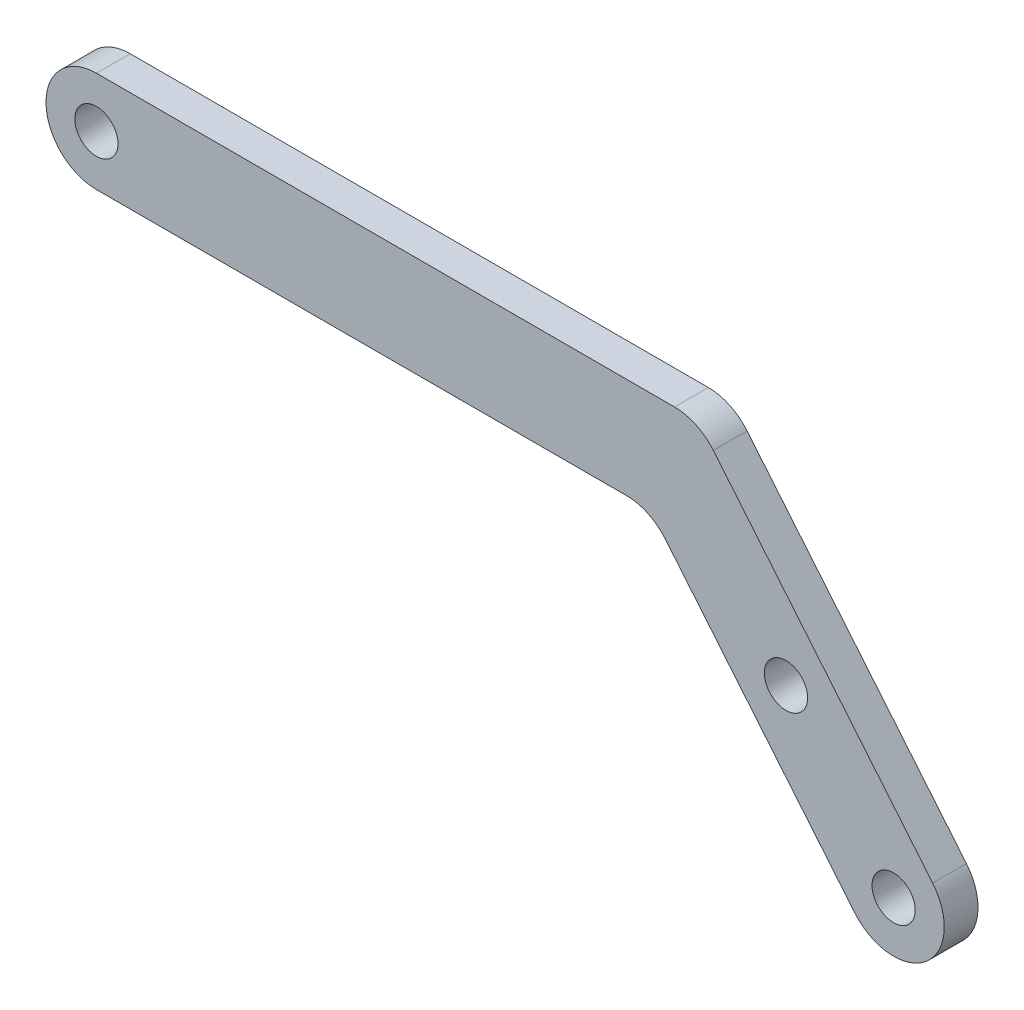
ISO-10303-21;
HEADER;
FILE_DESCRIPTION(('STEP AP214'),'2;1');
FILE_NAME('part.step','',(''),(''),'','','');
FILE_SCHEMA(('AUTOMOTIVE_DESIGN { 1 0 10303 214 1 1 1 1 }'));
ENDSEC;
DATA;
#1=APPLICATION_CONTEXT('core data for automotive mechanical design processes');
#2=APPLICATION_PROTOCOL_DEFINITION('international standard','automotive_design',2000,#1);
#3=PRODUCT_CONTEXT('',#1,'mechanical');
#4=PRODUCT('Part','Part','',(#3));
#5=PRODUCT_RELATED_PRODUCT_CATEGORY('part','',(#4));
#6=PRODUCT_DEFINITION_FORMATION('','',#4);
#7=PRODUCT_DEFINITION_CONTEXT('part definition',#1,'design');
#8=PRODUCT_DEFINITION('design','',#6,#7);
#9=PRODUCT_DEFINITION_SHAPE('','',#8);
#10=(LENGTH_UNIT() NAMED_UNIT(*) SI_UNIT(.MILLI.,.METRE.));
#11=(NAMED_UNIT(*) PLANE_ANGLE_UNIT() SI_UNIT($,.RADIAN.));
#12=(NAMED_UNIT(*) SI_UNIT($,.STERADIAN.) SOLID_ANGLE_UNIT());
#13=UNCERTAINTY_MEASURE_WITH_UNIT(LENGTH_MEASURE(1.E-05),#10,'distance_accuracy_value','');
#14=(GEOMETRIC_REPRESENTATION_CONTEXT(3) GLOBAL_UNCERTAINTY_ASSIGNED_CONTEXT((#13)) GLOBAL_UNIT_ASSIGNED_CONTEXT((#10,
#11,#12)) REPRESENTATION_CONTEXT('',''));
#15=CARTESIAN_POINT('',(0.,0.,0.));
#16=DIRECTION('',(0.,0.,1.));
#17=DIRECTION('',(1.,0.,0.));
#18=AXIS2_PLACEMENT_3D('',#15,#16,#17);
#19=CARTESIAN_POINT('',(-64.8477374915511,12.7,-3.175));
#20=DIRECTION('',(0.,0.,-1.));
#21=DIRECTION('',(1.,0.,0.));
#22=AXIS2_PLACEMENT_3D('',#19,#20,#21);
#23=PLANE('',#22);
#24=CARTESIAN_POINT('',(-64.8477374915511,12.7,-3.175));
#25=DIRECTION('',(0.,0.,1.));
#26=DIRECTION('',(1.,0.,0.));
#27=AXIS2_PLACEMENT_3D('',#24,#25,#26);
#28=CIRCLE('',#27,2.03200000000001);
#29=CARTESIAN_POINT('',(-62.8157374915511,12.7,-3.175));
#30=VERTEX_POINT('',#29);
#31=EDGE_CURVE('E316',#30,#30,#28,.T.);
#32=ORIENTED_EDGE('',*,*,#31,.T.);
#33=EDGE_LOOP('',(#32));
#34=FACE_BOUND('',#33,.T.);
#35=CARTESIAN_POINT('',(-64.8477374915511,12.7,-3.175));
#36=DIRECTION('',(0.,0.,1.));
#37=DIRECTION('',(1.,0.,0.));
#38=AXIS2_PLACEMENT_3D('',#35,#36,#37);
#39=CIRCLE('',#38,4.73793945012467);
#40=CARTESIAN_POINT('',(-64.8477374915511,17.4379394501247,-3.175));
#41=VERTEX_POINT('',#40);
#42=CARTESIAN_POINT('',(-64.8477374915511,7.96206054987534,-3.175));
#43=VERTEX_POINT('',#42);
#44=EDGE_CURVE('E159',#41,#43,#39,.T.);
#45=ORIENTED_EDGE('',*,*,#44,.F.);
#46=DIRECTION('',(-1.,0.,0.));
#47=VECTOR('',#46,1.);
#48=CARTESIAN_POINT('',(-64.8477374915511,17.4379394501247,-3.175));
#49=LINE('',#48,#47);
#50=CARTESIAN_POINT('',(-10.4775,17.4379394501247,-3.175));
#51=VERTEX_POINT('',#50);
#52=EDGE_CURVE('E133',#51,#41,#49,.T.);
#53=ORIENTED_EDGE('',*,*,#52,.F.);
#54=CARTESIAN_POINT('',(-10.4775,12.7,-3.175));
#55=DIRECTION('',(0.,0.,1.));
#56=DIRECTION('',(1.,0.,0.));
#57=AXIS2_PLACEMENT_3D('',#54,#55,#56);
#58=CIRCLE('',#57,4.73793945012467);
#59=CARTESIAN_POINT('',(-6.82728205039289,15.7205925169433,-3.175));
#60=VERTEX_POINT('',#59);
#61=EDGE_CURVE('E114',#60,#51,#58,.T.);
#62=ORIENTED_EDGE('',*,*,#61,.F.);
#63=DIRECTION('',(-0.637532950503155,0.770423089622022,0.));
#64=VECTOR('',#63,1.);
#65=CARTESIAN_POINT('',(-6.82728205039289,15.7205925169433,-3.175));
#66=LINE('',#65,#64);
#67=CARTESIAN_POINT('',(13.7899755535625,-9.19421587097833,-3.175));
#68=VERTEX_POINT('',#67);
#69=EDGE_CURVE('E124',#68,#60,#66,.T.);
#70=ORIENTED_EDGE('',*,*,#69,.F.);
#71=CARTESIAN_POINT('',(10.1208355892376,-12.2304665477496,-3.175));
#72=DIRECTION('',(0.,0.,1.));
#73=DIRECTION('',(1.,0.,0.));
#74=AXIS2_PLACEMENT_3D('',#71,#72,#73);
#75=CIRCLE('',#74,4.7625);
#76=CARTESIAN_POINT('',(6.4516956249127,-15.2667172245209,-3.175));
#77=VERTEX_POINT('',#76);
#78=EDGE_CURVE('E129',#77,#68,#75,.T.);
#79=ORIENTED_EDGE('',*,*,#78,.F.);
#80=DIRECTION('',(0.637532950503155,-0.770423089622022,0.));
#81=VECTOR('',#80,1.);
#82=CARTESIAN_POINT('',(6.4516956249127,-15.2667172245209,-3.175));
#83=LINE('',#82,#81);
#84=CARTESIAN_POINT('',(-11.3492324086339,6.24471361669395,-3.175));
#85=VERTEX_POINT('',#84);
#86=EDGE_CURVE('E185',#85,#77,#83,.T.);
#87=ORIENTED_EDGE('',*,*,#86,.F.);
#88=CARTESIAN_POINT('',(-14.999450358241,3.22412109975067,-3.175));
#89=DIRECTION('',(0.,0.,-1.));
#90=DIRECTION('',(1.,0.,0.));
#91=AXIS2_PLACEMENT_3D('',#88,#89,#90);
#92=CIRCLE('',#91,4.73793945012467);
#93=CARTESIAN_POINT('',(-14.999450358241,7.96206054987534,-3.175));
#94=VERTEX_POINT('',#93);
#95=EDGE_CURVE('E178',#94,#85,#92,.T.);
#96=ORIENTED_EDGE('',*,*,#95,.F.);
#97=DIRECTION('',(1.,0.,0.));
#98=VECTOR('',#97,1.);
#99=CARTESIAN_POINT('',(-14.999450358241,7.96206054987534,-3.175));
#100=LINE('',#99,#98);
#101=EDGE_CURVE('E168',#43,#94,#100,.T.);
#102=ORIENTED_EDGE('',*,*,#101,.F.);
#103=EDGE_LOOP('',(#45,#53,#62,#70,#79,#87,#96,#102));
#104=FACE_BOUND('',#103,.T.);
#105=CARTESIAN_POINT('',(0.,0.,-3.175));
#106=DIRECTION('',(0.,0.,1.));
#107=DIRECTION('',(1.,0.,0.));
#108=AXIS2_PLACEMENT_3D('',#105,#106,#107);
#109=CIRCLE('',#108,2.032);
#110=CARTESIAN_POINT('',(2.032,0.,-3.175));
#111=VERTEX_POINT('',#110);
#112=EDGE_CURVE('E142',#111,#111,#109,.T.);
#113=ORIENTED_EDGE('',*,*,#112,.T.);
#114=EDGE_LOOP('',(#113));
#115=FACE_BOUND('',#114,.T.);
#116=CARTESIAN_POINT('',(10.1208355892376,-12.2304665477496,-3.175));
#117=DIRECTION('',(0.,0.,1.));
#118=DIRECTION('',(1.,0.,0.));
#119=AXIS2_PLACEMENT_3D('',#116,#117,#118);
#120=CIRCLE('',#119,2.032);
#121=CARTESIAN_POINT('',(12.1528355892376,-12.2304665477496,-3.175));
#122=VERTEX_POINT('',#121);
#123=EDGE_CURVE('E307',#122,#122,#120,.T.);
#124=ORIENTED_EDGE('',*,*,#123,.T.);
#125=EDGE_LOOP('',(#124));
#126=FACE_BOUND('',#125,.T.);
#127=ADVANCED_FACE('F41',(#34,#104,#115,#126),#23,.T.);
#128=CARTESIAN_POINT('',(-64.8477374915511,12.7,0.));
#129=DIRECTION('',(0.,0.,-1.));
#130=DIRECTION('',(1.,0.,0.));
#131=AXIS2_PLACEMENT_3D('',#128,#129,#130);
#132=PLANE('',#131);
#133=CARTESIAN_POINT('',(-64.8477374915511,12.7,0.));
#134=DIRECTION('',(0.,0.,1.));
#135=DIRECTION('',(1.,0.,0.));
#136=AXIS2_PLACEMENT_3D('',#133,#134,#135);
#137=CIRCLE('',#136,4.73793945012467);
#138=CARTESIAN_POINT('',(-64.8477374915511,17.4379394501247,0.));
#139=VERTEX_POINT('',#138);
#140=CARTESIAN_POINT('',(-64.8477374915511,7.96206054987534,0.));
#141=VERTEX_POINT('',#140);
#142=EDGE_CURVE('E138',#139,#141,#137,.T.);
#143=ORIENTED_EDGE('',*,*,#142,.T.);
#144=DIRECTION('',(1.,0.,0.));
#145=VECTOR('',#144,1.);
#146=CARTESIAN_POINT('',(-14.999450358241,7.96206054987534,0.));
#147=LINE('',#146,#145);
#148=CARTESIAN_POINT('',(-14.999450358241,7.96206054987534,0.));
#149=VERTEX_POINT('',#148);
#150=EDGE_CURVE('E141',#141,#149,#147,.T.);
#151=ORIENTED_EDGE('',*,*,#150,.T.);
#152=CARTESIAN_POINT('',(-14.999450358241,3.22412109975067,0.));
#153=DIRECTION('',(0.,0.,-1.));
#154=DIRECTION('',(1.,0.,0.));
#155=AXIS2_PLACEMENT_3D('',#152,#153,#154);
#156=CIRCLE('',#155,4.73793945012467);
#157=CARTESIAN_POINT('',(-11.3492324086339,6.24471361669395,0.));
#158=VERTEX_POINT('',#157);
#159=EDGE_CURVE('E145',#149,#158,#156,.T.);
#160=ORIENTED_EDGE('',*,*,#159,.T.);
#161=DIRECTION('',(0.637532950503155,-0.770423089622022,0.));
#162=VECTOR('',#161,1.);
#163=CARTESIAN_POINT('',(6.4516956249127,-15.2667172245209,0.));
#164=LINE('',#163,#162);
#165=CARTESIAN_POINT('',(6.4516956249127,-15.2667172245209,0.));
#166=VERTEX_POINT('',#165);
#167=EDGE_CURVE('E148',#158,#166,#164,.T.);
#168=ORIENTED_EDGE('',*,*,#167,.T.);
#169=CARTESIAN_POINT('',(10.1208355892376,-12.2304665477496,0.));
#170=DIRECTION('',(0.,0.,1.));
#171=DIRECTION('',(1.,0.,0.));
#172=AXIS2_PLACEMENT_3D('',#169,#170,#171);
#173=CIRCLE('',#172,4.7625);
#174=CARTESIAN_POINT('',(13.7899755535625,-9.19421587097833,0.));
#175=VERTEX_POINT('',#174);
#176=EDGE_CURVE('E151',#166,#175,#173,.T.);
#177=ORIENTED_EDGE('',*,*,#176,.T.);
#178=DIRECTION('',(-0.637532950503155,0.770423089622022,0.));
#179=VECTOR('',#178,1.);
#180=CARTESIAN_POINT('',(-6.82728205039289,15.7205925169433,0.));
#181=LINE('',#180,#179);
#182=CARTESIAN_POINT('',(-6.82728205039289,15.7205925169433,0.));
#183=VERTEX_POINT('',#182);
#184=EDGE_CURVE('E154',#175,#183,#181,.T.);
#185=ORIENTED_EDGE('',*,*,#184,.T.);
#186=CARTESIAN_POINT('',(-10.4775,12.7,0.));
#187=DIRECTION('',(0.,0.,1.));
#188=DIRECTION('',(1.,0.,0.));
#189=AXIS2_PLACEMENT_3D('',#186,#187,#188);
#190=CIRCLE('',#189,4.73793945012467);
#191=CARTESIAN_POINT('',(-10.4775,17.4379394501247,0.));
#192=VERTEX_POINT('',#191);
#193=EDGE_CURVE('E117',#183,#192,#190,.T.);
#194=ORIENTED_EDGE('',*,*,#193,.T.);
#195=DIRECTION('',(-1.,0.,0.));
#196=VECTOR('',#195,1.);
#197=CARTESIAN_POINT('',(-64.8477374915511,17.4379394501247,0.));
#198=LINE('',#197,#196);
#199=EDGE_CURVE('E157',#192,#139,#198,.T.);
#200=ORIENTED_EDGE('',*,*,#199,.T.);
#201=EDGE_LOOP('',(#143,#151,#160,#168,#177,#185,#194,#200));
#202=FACE_BOUND('',#201,.T.);
#203=CARTESIAN_POINT('',(0.,0.,0.));
#204=DIRECTION('',(0.,0.,1.));
#205=DIRECTION('',(1.,0.,0.));
#206=AXIS2_PLACEMENT_3D('',#203,#204,#205);
#207=CIRCLE('',#206,2.032);
#208=CARTESIAN_POINT('',(2.032,0.,0.));
#209=VERTEX_POINT('',#208);
#210=EDGE_CURVE('E181',#209,#209,#207,.T.);
#211=ORIENTED_EDGE('',*,*,#210,.F.);
#212=EDGE_LOOP('',(#211));
#213=FACE_BOUND('',#212,.T.);
#214=CARTESIAN_POINT('',(-64.8477374915511,12.7,0.));
#215=DIRECTION('',(0.,0.,1.));
#216=DIRECTION('',(1.,0.,0.));
#217=AXIS2_PLACEMENT_3D('',#214,#215,#216);
#218=CIRCLE('',#217,2.03200000000001);
#219=CARTESIAN_POINT('',(-62.8157374915511,12.7,0.));
#220=VERTEX_POINT('',#219);
#221=EDGE_CURVE('E313',#220,#220,#218,.T.);
#222=ORIENTED_EDGE('',*,*,#221,.F.);
#223=EDGE_LOOP('',(#222));
#224=FACE_BOUND('',#223,.T.);
#225=CARTESIAN_POINT('',(10.1208355892376,-12.2304665477496,0.));
#226=DIRECTION('',(0.,0.,1.));
#227=DIRECTION('',(1.,0.,0.));
#228=AXIS2_PLACEMENT_3D('',#225,#226,#227);
#229=CIRCLE('',#228,2.032);
#230=CARTESIAN_POINT('',(12.1528355892376,-12.2304665477496,0.));
#231=VERTEX_POINT('',#230);
#232=EDGE_CURVE('E310',#231,#231,#229,.T.);
#233=ORIENTED_EDGE('',*,*,#232,.F.);
#234=EDGE_LOOP('',(#233));
#235=FACE_BOUND('',#234,.T.);
#236=ADVANCED_FACE('F175',(#202,#213,#224,#235),#132,.F.);
#237=CARTESIAN_POINT('',(-64.8477374915511,12.7,-3.175));
#238=DIRECTION('',(0.,0.,1.));
#239=DIRECTION('',(-1.,0.,0.));
#240=AXIS2_PLACEMENT_3D('',#237,#238,#239);
#241=CYLINDRICAL_SURFACE('',#240,4.73793945012467);
#242=ORIENTED_EDGE('',*,*,#142,.F.);
#243=DIRECTION('',(0.,0.,1.));
#244=VECTOR('',#243,1.);
#245=CARTESIAN_POINT('',(-64.8477374915511,17.4379394501247,-3.175));
#246=LINE('',#245,#244);
#247=EDGE_CURVE('E58',#41,#139,#246,.T.);
#248=ORIENTED_EDGE('',*,*,#247,.F.);
#249=ORIENTED_EDGE('',*,*,#44,.T.);
#250=DIRECTION('',(0.,0.,1.));
#251=VECTOR('',#250,1.);
#252=CARTESIAN_POINT('',(-64.8477374915511,7.96206054987534,-3.175));
#253=LINE('',#252,#251);
#254=EDGE_CURVE('E11',#43,#141,#253,.T.);
#255=ORIENTED_EDGE('',*,*,#254,.T.);
#256=EDGE_LOOP('',(#242,#248,#249,#255));
#257=FACE_BOUND('',#256,.T.);
#258=ADVANCED_FACE('F43',(#257),#241,.T.);
#259=CARTESIAN_POINT('',(-14.999450358241,7.96206054987534,-3.175));
#260=DIRECTION('',(0.,1.,0.));
#261=DIRECTION('',(-1.,0.,0.));
#262=AXIS2_PLACEMENT_3D('',#259,#260,#261);
#263=PLANE('',#262);
#264=ORIENTED_EDGE('',*,*,#150,.F.);
#265=ORIENTED_EDGE('',*,*,#254,.F.);
#266=ORIENTED_EDGE('',*,*,#101,.T.);
#267=DIRECTION('',(0.,0.,1.));
#268=VECTOR('',#267,1.);
#269=CARTESIAN_POINT('',(-14.999450358241,7.96206054987534,-3.175));
#270=LINE('',#269,#268);
#271=EDGE_CURVE('E50',#94,#149,#270,.T.);
#272=ORIENTED_EDGE('',*,*,#271,.T.);
#273=EDGE_LOOP('',(#264,#265,#266,#272));
#274=FACE_BOUND('',#273,.T.);
#275=ADVANCED_FACE('F167',(#274),#263,.F.);
#276=CARTESIAN_POINT('',(-14.999450358241,3.22412109975067,-3.175));
#277=DIRECTION('',(0.,0.,1.));
#278=DIRECTION('',(-1.,0.,0.));
#279=AXIS2_PLACEMENT_3D('',#276,#277,#278);
#280=CYLINDRICAL_SURFACE('',#279,4.73793945012467);
#281=ORIENTED_EDGE('',*,*,#159,.F.);
#282=ORIENTED_EDGE('',*,*,#271,.F.);
#283=ORIENTED_EDGE('',*,*,#95,.T.);
#284=DIRECTION('',(0.,0.,1.));
#285=VECTOR('',#284,1.);
#286=CARTESIAN_POINT('',(-11.3492324086339,6.24471361669395,-3.175));
#287=LINE('',#286,#285);
#288=EDGE_CURVE('E165',#85,#158,#287,.T.);
#289=ORIENTED_EDGE('',*,*,#288,.T.);
#290=EDGE_LOOP('',(#281,#282,#283,#289));
#291=FACE_BOUND('',#290,.T.);
#292=ADVANCED_FACE('F172',(#291),#280,.F.);
#293=CARTESIAN_POINT('',(6.4516956249127,-15.2667172245209,-3.175));
#294=DIRECTION('',(0.770423089622022,0.637532950503155,0.));
#295=DIRECTION('',(-0.637532950503155,0.770423089622022,0.));
#296=AXIS2_PLACEMENT_3D('',#293,#294,#295);
#297=PLANE('',#296);
#298=ORIENTED_EDGE('',*,*,#167,.F.);
#299=ORIENTED_EDGE('',*,*,#288,.F.);
#300=ORIENTED_EDGE('',*,*,#86,.T.);
#301=DIRECTION('',(0.,0.,1.));
#302=VECTOR('',#301,1.);
#303=CARTESIAN_POINT('',(6.4516956249127,-15.2667172245209,-3.175));
#304=LINE('',#303,#302);
#305=EDGE_CURVE('E163',#77,#166,#304,.T.);
#306=ORIENTED_EDGE('',*,*,#305,.T.);
#307=EDGE_LOOP('',(#298,#299,#300,#306));
#308=FACE_BOUND('',#307,.T.);
#309=ADVANCED_FACE('F192',(#308),#297,.F.);
#310=CARTESIAN_POINT('',(10.1208355892376,-12.2304665477496,-3.175));
#311=DIRECTION('',(0.,0.,1.));
#312=DIRECTION('',(-1.,0.,0.));
#313=AXIS2_PLACEMENT_3D('',#310,#311,#312);
#314=CYLINDRICAL_SURFACE('',#313,4.7625);
#315=ORIENTED_EDGE('',*,*,#176,.F.);
#316=ORIENTED_EDGE('',*,*,#305,.F.);
#317=ORIENTED_EDGE('',*,*,#78,.T.);
#318=DIRECTION('',(0.,0.,1.));
#319=VECTOR('',#318,1.);
#320=CARTESIAN_POINT('',(13.7899755535625,-9.19421587097833,-3.175));
#321=LINE('',#320,#319);
#322=EDGE_CURVE('E121',#68,#175,#321,.T.);
#323=ORIENTED_EDGE('',*,*,#322,.T.);
#324=EDGE_LOOP('',(#315,#316,#317,#323));
#325=FACE_BOUND('',#324,.T.);
#326=ADVANCED_FACE('F189',(#325),#314,.T.);
#327=CARTESIAN_POINT('',(-6.82728205039289,15.7205925169433,-3.175));
#328=DIRECTION('',(-0.770423089622022,-0.637532950503155,0.));
#329=DIRECTION('',(0.637532950503155,-0.770423089622022,0.));
#330=AXIS2_PLACEMENT_3D('',#327,#328,#329);
#331=PLANE('',#330);
#332=ORIENTED_EDGE('',*,*,#184,.F.);
#333=ORIENTED_EDGE('',*,*,#322,.F.);
#334=ORIENTED_EDGE('',*,*,#69,.T.);
#335=DIRECTION('',(0.,0.,1.));
#336=VECTOR('',#335,1.);
#337=CARTESIAN_POINT('',(-6.82728205039289,15.7205925169433,-3.175));
#338=LINE('',#337,#336);
#339=EDGE_CURVE('E110',#60,#183,#338,.T.);
#340=ORIENTED_EDGE('',*,*,#339,.T.);
#341=EDGE_LOOP('',(#332,#333,#334,#340));
#342=FACE_BOUND('',#341,.T.);
#343=ADVANCED_FACE('F125',(#342),#331,.F.);
#344=CARTESIAN_POINT('',(-10.4775,12.7,-3.175));
#345=DIRECTION('',(0.,0.,1.));
#346=DIRECTION('',(-1.,0.,0.));
#347=AXIS2_PLACEMENT_3D('',#344,#345,#346);
#348=CYLINDRICAL_SURFACE('',#347,4.73793945012467);
#349=ORIENTED_EDGE('',*,*,#193,.F.);
#350=ORIENTED_EDGE('',*,*,#339,.F.);
#351=ORIENTED_EDGE('',*,*,#61,.T.);
#352=DIRECTION('',(0.,0.,1.));
#353=VECTOR('',#352,1.);
#354=CARTESIAN_POINT('',(-10.4775,17.4379394501247,-3.175));
#355=LINE('',#354,#353);
#356=EDGE_CURVE('E86',#51,#192,#355,.T.);
#357=ORIENTED_EDGE('',*,*,#356,.T.);
#358=EDGE_LOOP('',(#349,#350,#351,#357));
#359=FACE_BOUND('',#358,.T.);
#360=ADVANCED_FACE('F112',(#359),#348,.T.);
#361=CARTESIAN_POINT('',(-64.8477374915511,17.4379394501247,-3.175));
#362=DIRECTION('',(0.,-1.,0.));
#363=DIRECTION('',(0.,0.,1.));
#364=AXIS2_PLACEMENT_3D('',#361,#362,#363);
#365=PLANE('',#364);
#366=ORIENTED_EDGE('',*,*,#199,.F.);
#367=ORIENTED_EDGE('',*,*,#356,.F.);
#368=ORIENTED_EDGE('',*,*,#52,.T.);
#369=ORIENTED_EDGE('',*,*,#247,.T.);
#370=EDGE_LOOP('',(#366,#367,#368,#369));
#371=FACE_BOUND('',#370,.T.);
#372=ADVANCED_FACE('F213',(#371),#365,.F.);
#373=CARTESIAN_POINT('',(0.,0.,-3.175));
#374=DIRECTION('',(0.,0.,1.));
#375=DIRECTION('',(-1.,0.,0.));
#376=AXIS2_PLACEMENT_3D('',#373,#374,#375);
#377=CYLINDRICAL_SURFACE('',#376,2.032);
#378=ORIENTED_EDGE('',*,*,#112,.F.);
#379=EDGE_LOOP('',(#378));
#380=FACE_BOUND('',#379,.T.);
#381=ORIENTED_EDGE('',*,*,#210,.T.);
#382=EDGE_LOOP('',(#381));
#383=FACE_BOUND('',#382,.T.);
#384=ADVANCED_FACE('F210',(#380,#383),#377,.F.);
#385=CARTESIAN_POINT('',(-64.8477374915511,12.7,-3.175));
#386=DIRECTION('',(0.,0.,1.));
#387=DIRECTION('',(-1.,0.,0.));
#388=AXIS2_PLACEMENT_3D('',#385,#386,#387);
#389=CYLINDRICAL_SURFACE('',#388,2.03200000000001);
#390=ORIENTED_EDGE('',*,*,#31,.F.);
#391=EDGE_LOOP('',(#390));
#392=FACE_BOUND('',#391,.T.);
#393=ORIENTED_EDGE('',*,*,#221,.T.);
#394=EDGE_LOOP('',(#393));
#395=FACE_BOUND('',#394,.T.);
#396=ADVANCED_FACE('F240',(#392,#395),#389,.F.);
#397=CARTESIAN_POINT('',(10.1208355892376,-12.2304665477496,-3.175));
#398=DIRECTION('',(0.,0.,1.));
#399=DIRECTION('',(-1.,0.,0.));
#400=AXIS2_PLACEMENT_3D('',#397,#398,#399);
#401=CYLINDRICAL_SURFACE('',#400,2.032);
#402=ORIENTED_EDGE('',*,*,#123,.F.);
#403=EDGE_LOOP('',(#402));
#404=FACE_BOUND('',#403,.T.);
#405=ORIENTED_EDGE('',*,*,#232,.T.);
#406=EDGE_LOOP('',(#405));
#407=FACE_BOUND('',#406,.T.);
#408=ADVANCED_FACE('F248',(#404,#407),#401,.F.);
#409=CLOSED_SHELL('',(#127,#236,#258,#275,#292,#309,#326,#343,#360,#372,#384,#396,#408));
#410=MANIFOLD_SOLID_BREP('B2',#409);
#411=ADVANCED_BREP_SHAPE_REPRESENTATION('',(#18,#410),#14);
#412=SHAPE_DEFINITION_REPRESENTATION(#9,#411);
ENDSEC;
END-ISO-10303-21;
